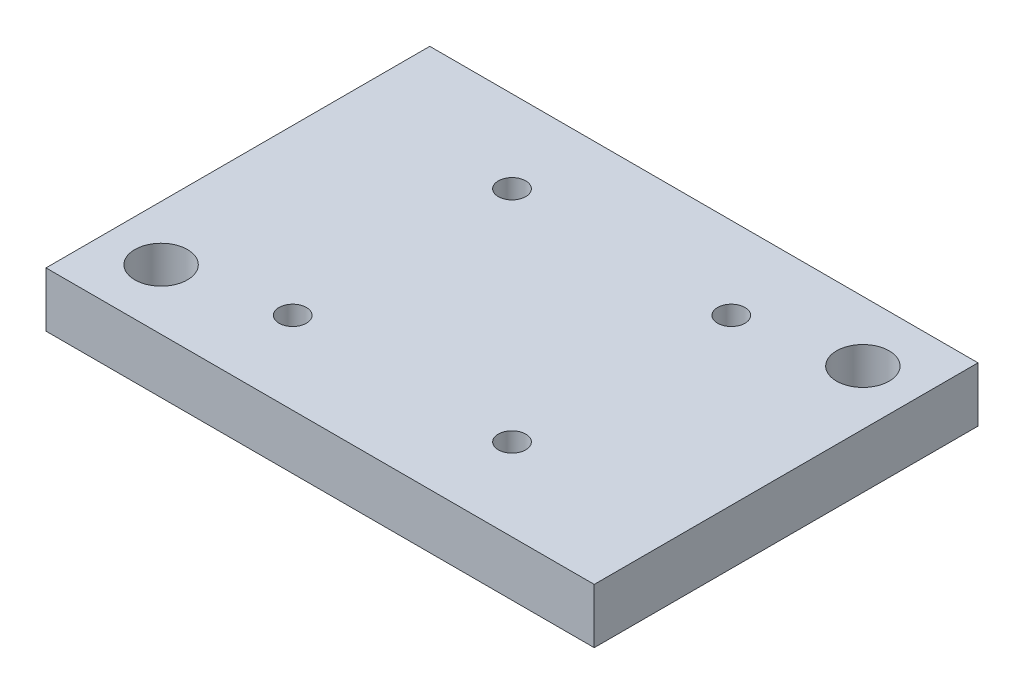
ISO-10303-21;
HEADER;
FILE_DESCRIPTION(('STEP AP214'),'2;1');
FILE_NAME('part.step','',(''),(''),'','','');
FILE_SCHEMA(('AUTOMOTIVE_DESIGN { 1 0 10303 214 1 1 1 1 }'));
ENDSEC;
DATA;
#1=APPLICATION_CONTEXT('core data for automotive mechanical design processes');
#2=APPLICATION_PROTOCOL_DEFINITION('international standard','automotive_design',2000,#1);
#3=PRODUCT_CONTEXT('',#1,'mechanical');
#4=PRODUCT('Part','Part','',(#3));
#5=PRODUCT_RELATED_PRODUCT_CATEGORY('part','',(#4));
#6=PRODUCT_DEFINITION_FORMATION('','',#4);
#7=PRODUCT_DEFINITION_CONTEXT('part definition',#1,'design');
#8=PRODUCT_DEFINITION('design','',#6,#7);
#9=PRODUCT_DEFINITION_SHAPE('','',#8);
#10=(LENGTH_UNIT() NAMED_UNIT(*) SI_UNIT(.MILLI.,.METRE.));
#11=(NAMED_UNIT(*) PLANE_ANGLE_UNIT() SI_UNIT($,.RADIAN.));
#12=(NAMED_UNIT(*) SI_UNIT($,.STERADIAN.) SOLID_ANGLE_UNIT());
#13=UNCERTAINTY_MEASURE_WITH_UNIT(LENGTH_MEASURE(1.E-05),#10,'distance_accuracy_value','');
#14=(GEOMETRIC_REPRESENTATION_CONTEXT(3) GLOBAL_UNCERTAINTY_ASSIGNED_CONTEXT((#13)) GLOBAL_UNIT_ASSIGNED_CONTEXT((#10,
#11,#12)) REPRESENTATION_CONTEXT('',''));
#15=CARTESIAN_POINT('',(0.,0.,0.));
#16=DIRECTION('',(0.,0.,1.));
#17=DIRECTION('',(1.,0.,0.));
#18=AXIS2_PLACEMENT_3D('',#15,#16,#17);
#19=CARTESIAN_POINT('',(-18.4285714285714,5.,-15.1428571428572));
#20=DIRECTION('',(1.,0.,0.));
#21=DIRECTION('',(0.,0.,-1.));
#22=AXIS2_PLACEMENT_3D('',#19,#20,#21);
#23=PLANE('',#22);
#24=DIRECTION('',(0.,0.,1.));
#25=VECTOR('',#24,1.);
#26=CARTESIAN_POINT('',(-18.4285714285714,0.,-15.1428571428572));
#27=LINE('',#26,#25);
#28=CARTESIAN_POINT('',(-18.4285714285714,0.,-15.1428571428572));
#29=VERTEX_POINT('',#28);
#30=CARTESIAN_POINT('',(-18.4285714285714,0.,19.8571428571429));
#31=VERTEX_POINT('',#30);
#32=EDGE_CURVE('E102',#29,#31,#27,.T.);
#33=ORIENTED_EDGE('',*,*,#32,.T.);
#34=DIRECTION('',(0.,-1.,0.));
#35=VECTOR('',#34,1.);
#36=CARTESIAN_POINT('',(-18.4285714285714,5.,19.8571428571429));
#37=LINE('',#36,#35);
#38=CARTESIAN_POINT('',(-18.4285714285714,5.,19.8571428571429));
#39=VERTEX_POINT('',#38);
#40=EDGE_CURVE('E11',#39,#31,#37,.T.);
#41=ORIENTED_EDGE('',*,*,#40,.F.);
#42=DIRECTION('',(0.,0.,1.));
#43=VECTOR('',#42,1.);
#44=CARTESIAN_POINT('',(-18.4285714285714,5.,-15.1428571428572));
#45=LINE('',#44,#43);
#46=CARTESIAN_POINT('',(-18.4285714285714,5.,-15.1428571428572));
#47=VERTEX_POINT('',#46);
#48=EDGE_CURVE('E90',#47,#39,#45,.T.);
#49=ORIENTED_EDGE('',*,*,#48,.F.);
#50=DIRECTION('',(0.,-1.,0.));
#51=VECTOR('',#50,1.);
#52=CARTESIAN_POINT('',(-18.4285714285714,5.,-15.1428571428572));
#53=LINE('',#52,#51);
#54=EDGE_CURVE('E98',#47,#29,#53,.T.);
#55=ORIENTED_EDGE('',*,*,#54,.T.);
#56=EDGE_LOOP('',(#33,#41,#49,#55));
#57=FACE_BOUND('',#56,.T.);
#58=ADVANCED_FACE('F39',(#57),#23,.F.);
#59=CARTESIAN_POINT('',(-18.4285714285714,5.,19.8571428571429));
#60=DIRECTION('',(0.,0.,-1.));
#61=DIRECTION('',(-1.,0.,0.));
#62=AXIS2_PLACEMENT_3D('',#59,#60,#61);
#63=PLANE('',#62);
#64=DIRECTION('',(1.,0.,0.));
#65=VECTOR('',#64,1.);
#66=CARTESIAN_POINT('',(-18.4285714285714,0.,19.8571428571429));
#67=LINE('',#66,#65);
#68=CARTESIAN_POINT('',(31.5714285714286,0.,19.8571428571429));
#69=VERTEX_POINT('',#68);
#70=EDGE_CURVE('E94',#31,#69,#67,.T.);
#71=ORIENTED_EDGE('',*,*,#70,.T.);
#72=DIRECTION('',(0.,-1.,0.));
#73=VECTOR('',#72,1.);
#74=CARTESIAN_POINT('',(31.5714285714286,5.,19.8571428571429));
#75=LINE('',#74,#73);
#76=CARTESIAN_POINT('',(31.5714285714286,5.,19.8571428571429));
#77=VERTEX_POINT('',#76);
#78=EDGE_CURVE('E47',#77,#69,#75,.T.);
#79=ORIENTED_EDGE('',*,*,#78,.F.);
#80=DIRECTION('',(1.,0.,0.));
#81=VECTOR('',#80,1.);
#82=CARTESIAN_POINT('',(-18.4285714285714,5.,19.8571428571429));
#83=LINE('',#82,#81);
#84=EDGE_CURVE('E85',#39,#77,#83,.T.);
#85=ORIENTED_EDGE('',*,*,#84,.F.);
#86=ORIENTED_EDGE('',*,*,#40,.T.);
#87=EDGE_LOOP('',(#71,#79,#85,#86));
#88=FACE_BOUND('',#87,.T.);
#89=ADVANCED_FACE('F93',(#88),#63,.F.);
#90=CARTESIAN_POINT('',(31.5714285714286,5.,-15.1428571428572));
#91=DIRECTION('',(-1.,0.,0.));
#92=DIRECTION('',(0.,0.,1.));
#93=AXIS2_PLACEMENT_3D('',#90,#91,#92);
#94=PLANE('',#93);
#95=DIRECTION('',(0.,0.,-1.));
#96=VECTOR('',#95,1.);
#97=CARTESIAN_POINT('',(31.5714285714286,0.,-15.1428571428572));
#98=LINE('',#97,#96);
#99=CARTESIAN_POINT('',(31.5714285714286,0.,-15.1428571428572));
#100=VERTEX_POINT('',#99);
#101=EDGE_CURVE('E72',#69,#100,#98,.T.);
#102=ORIENTED_EDGE('',*,*,#101,.T.);
#103=DIRECTION('',(0.,-1.,0.));
#104=VECTOR('',#103,1.);
#105=CARTESIAN_POINT('',(31.5714285714286,5.,-15.1428571428572));
#106=LINE('',#105,#104);
#107=CARTESIAN_POINT('',(31.5714285714286,5.,-15.1428571428572));
#108=VERTEX_POINT('',#107);
#109=EDGE_CURVE('E95',#108,#100,#106,.T.);
#110=ORIENTED_EDGE('',*,*,#109,.F.);
#111=DIRECTION('',(0.,0.,-1.));
#112=VECTOR('',#111,1.);
#113=CARTESIAN_POINT('',(31.5714285714286,5.,-15.1428571428572));
#114=LINE('',#113,#112);
#115=EDGE_CURVE('E88',#77,#108,#114,.T.);
#116=ORIENTED_EDGE('',*,*,#115,.F.);
#117=ORIENTED_EDGE('',*,*,#78,.T.);
#118=EDGE_LOOP('',(#102,#110,#116,#117));
#119=FACE_BOUND('',#118,.T.);
#120=ADVANCED_FACE('F96',(#119),#94,.F.);
#121=CARTESIAN_POINT('',(-18.4285714285714,5.,-15.1428571428572));
#122=DIRECTION('',(0.,0.,1.));
#123=DIRECTION('',(1.,0.,0.));
#124=AXIS2_PLACEMENT_3D('',#121,#122,#123);
#125=PLANE('',#124);
#126=DIRECTION('',(-1.,0.,0.));
#127=VECTOR('',#126,1.);
#128=CARTESIAN_POINT('',(-18.4285714285714,0.,-15.1428571428572));
#129=LINE('',#128,#127);
#130=EDGE_CURVE('E78',#100,#29,#129,.T.);
#131=ORIENTED_EDGE('',*,*,#130,.T.);
#132=ORIENTED_EDGE('',*,*,#54,.F.);
#133=DIRECTION('',(-1.,0.,0.));
#134=VECTOR('',#133,1.);
#135=CARTESIAN_POINT('',(-18.4285714285714,5.,-15.1428571428572));
#136=LINE('',#135,#134);
#137=EDGE_CURVE('E55',#108,#47,#136,.T.);
#138=ORIENTED_EDGE('',*,*,#137,.F.);
#139=ORIENTED_EDGE('',*,*,#109,.T.);
#140=EDGE_LOOP('',(#131,#132,#138,#139));
#141=FACE_BOUND('',#140,.T.);
#142=ADVANCED_FACE('F110',(#141),#125,.F.);
#143=CARTESIAN_POINT('',(0.,5.,0.));
#144=DIRECTION('',(0.,1.,0.));
#145=DIRECTION('',(0.,0.,1.));
#146=AXIS2_PLACEMENT_3D('',#143,#144,#145);
#147=PLANE('',#146);
#148=CARTESIAN_POINT('',(-13.4285714285714,5.,14.3571428571429));
#149=DIRECTION('',(0.,1.,0.));
#150=DIRECTION('',(0.,0.,1.));
#151=AXIS2_PLACEMENT_3D('',#148,#149,#150);
#152=CIRCLE('',#151,2.4);
#153=CARTESIAN_POINT('',(-13.4285714285714,5.,16.7571428571429));
#154=VERTEX_POINT('',#153);
#155=EDGE_CURVE('E148',#154,#154,#152,.T.);
#156=ORIENTED_EDGE('',*,*,#155,.F.);
#157=EDGE_LOOP('',(#156));
#158=FACE_BOUND('',#157,.T.);
#159=CARTESIAN_POINT('',(26.5714285714286,5.,-9.64285714285715));
#160=DIRECTION('',(0.,1.,0.));
#161=DIRECTION('',(0.,0.,1.));
#162=AXIS2_PLACEMENT_3D('',#159,#160,#161);
#163=CIRCLE('',#162,2.4);
#164=CARTESIAN_POINT('',(26.5714285714286,5.,-7.24285714285715));
#165=VERTEX_POINT('',#164);
#166=EDGE_CURVE('E142',#165,#165,#163,.T.);
#167=ORIENTED_EDGE('',*,*,#166,.F.);
#168=EDGE_LOOP('',(#167));
#169=FACE_BOUND('',#168,.T.);
#170=CARTESIAN_POINT('',(-3.42857142857143,5.,-7.64285714285715));
#171=DIRECTION('',(0.,1.,0.));
#172=DIRECTION('',(0.,0.,1.));
#173=AXIS2_PLACEMENT_3D('',#170,#171,#172);
#174=CIRCLE('',#173,1.25);
#175=CARTESIAN_POINT('',(-3.42857142857143,5.,-6.39285714285715));
#176=VERTEX_POINT('',#175);
#177=EDGE_CURVE('E136',#176,#176,#174,.T.);
#178=ORIENTED_EDGE('',*,*,#177,.F.);
#179=EDGE_LOOP('',(#178));
#180=FACE_BOUND('',#179,.T.);
#181=CARTESIAN_POINT('',(-3.42857142857143,5.,12.3571428571429));
#182=DIRECTION('',(0.,1.,0.));
#183=DIRECTION('',(0.,0.,1.));
#184=AXIS2_PLACEMENT_3D('',#181,#182,#183);
#185=CIRCLE('',#184,1.25);
#186=CARTESIAN_POINT('',(-3.42857142857143,5.,13.6071428571429));
#187=VERTEX_POINT('',#186);
#188=EDGE_CURVE('E130',#187,#187,#185,.T.);
#189=ORIENTED_EDGE('',*,*,#188,.F.);
#190=EDGE_LOOP('',(#189));
#191=FACE_BOUND('',#190,.T.);
#192=CARTESIAN_POINT('',(16.5714285714286,5.,12.3571428571428));
#193=DIRECTION('',(0.,1.,0.));
#194=DIRECTION('',(0.,0.,1.));
#195=AXIS2_PLACEMENT_3D('',#192,#193,#194);
#196=CIRCLE('',#195,1.25);
#197=CARTESIAN_POINT('',(16.5714285714286,5.,13.6071428571428));
#198=VERTEX_POINT('',#197);
#199=EDGE_CURVE('E124',#198,#198,#196,.T.);
#200=ORIENTED_EDGE('',*,*,#199,.F.);
#201=EDGE_LOOP('',(#200));
#202=FACE_BOUND('',#201,.T.);
#203=CARTESIAN_POINT('',(16.5714285714286,5.,-7.64285714285715));
#204=DIRECTION('',(0.,1.,0.));
#205=DIRECTION('',(0.,0.,1.));
#206=AXIS2_PLACEMENT_3D('',#203,#204,#205);
#207=CIRCLE('',#206,1.25);
#208=CARTESIAN_POINT('',(16.5714285714286,5.,-6.39285714285715));
#209=VERTEX_POINT('',#208);
#210=EDGE_CURVE('E118',#209,#209,#207,.T.);
#211=ORIENTED_EDGE('',*,*,#210,.F.);
#212=EDGE_LOOP('',(#211));
#213=FACE_BOUND('',#212,.T.);
#214=ORIENTED_EDGE('',*,*,#48,.T.);
#215=ORIENTED_EDGE('',*,*,#84,.T.);
#216=ORIENTED_EDGE('',*,*,#115,.T.);
#217=ORIENTED_EDGE('',*,*,#137,.T.);
#218=EDGE_LOOP('',(#214,#215,#216,#217));
#219=FACE_BOUND('',#218,.T.);
#220=ADVANCED_FACE('F86',(#158,#169,#180,#191,#202,#213,#219),#147,.T.);
#221=CARTESIAN_POINT('',(0.,0.,0.));
#222=DIRECTION('',(0.,1.,0.));
#223=DIRECTION('',(0.,0.,1.));
#224=AXIS2_PLACEMENT_3D('',#221,#222,#223);
#225=PLANE('',#224);
#226=CARTESIAN_POINT('',(-13.4285714285714,0.,14.3571428571429));
#227=DIRECTION('',(0.,1.,0.));
#228=DIRECTION('',(0.,0.,1.));
#229=AXIS2_PLACEMENT_3D('',#226,#227,#228);
#230=CIRCLE('',#229,2.4);
#231=CARTESIAN_POINT('',(-13.4285714285714,0.,16.7571428571428));
#232=VERTEX_POINT('',#231);
#233=EDGE_CURVE('E145',#232,#232,#230,.T.);
#234=ORIENTED_EDGE('',*,*,#233,.T.);
#235=EDGE_LOOP('',(#234));
#236=FACE_BOUND('',#235,.T.);
#237=CARTESIAN_POINT('',(26.5714285714286,0.,-9.64285714285715));
#238=DIRECTION('',(0.,1.,0.));
#239=DIRECTION('',(0.,0.,1.));
#240=AXIS2_PLACEMENT_3D('',#237,#238,#239);
#241=CIRCLE('',#240,2.4);
#242=CARTESIAN_POINT('',(26.5714285714286,0.,-7.24285714285715));
#243=VERTEX_POINT('',#242);
#244=EDGE_CURVE('E139',#243,#243,#241,.T.);
#245=ORIENTED_EDGE('',*,*,#244,.T.);
#246=EDGE_LOOP('',(#245));
#247=FACE_BOUND('',#246,.T.);
#248=CARTESIAN_POINT('',(-3.42857142857143,0.,-7.64285714285715));
#249=DIRECTION('',(0.,1.,0.));
#250=DIRECTION('',(0.,0.,1.));
#251=AXIS2_PLACEMENT_3D('',#248,#249,#250);
#252=CIRCLE('',#251,1.25);
#253=CARTESIAN_POINT('',(-3.42857142857143,0.,-6.39285714285715));
#254=VERTEX_POINT('',#253);
#255=EDGE_CURVE('E133',#254,#254,#252,.T.);
#256=ORIENTED_EDGE('',*,*,#255,.T.);
#257=EDGE_LOOP('',(#256));
#258=FACE_BOUND('',#257,.T.);
#259=CARTESIAN_POINT('',(-3.42857142857143,0.,12.3571428571429));
#260=DIRECTION('',(0.,1.,0.));
#261=DIRECTION('',(0.,0.,1.));
#262=AXIS2_PLACEMENT_3D('',#259,#260,#261);
#263=CIRCLE('',#262,1.25);
#264=CARTESIAN_POINT('',(-3.42857142857143,0.,13.6071428571428));
#265=VERTEX_POINT('',#264);
#266=EDGE_CURVE('E127',#265,#265,#263,.T.);
#267=ORIENTED_EDGE('',*,*,#266,.T.);
#268=EDGE_LOOP('',(#267));
#269=FACE_BOUND('',#268,.T.);
#270=CARTESIAN_POINT('',(16.5714285714286,0.,12.3571428571428));
#271=DIRECTION('',(0.,1.,0.));
#272=DIRECTION('',(0.,0.,1.));
#273=AXIS2_PLACEMENT_3D('',#270,#271,#272);
#274=CIRCLE('',#273,1.25);
#275=CARTESIAN_POINT('',(16.5714285714286,0.,13.6071428571428));
#276=VERTEX_POINT('',#275);
#277=EDGE_CURVE('E121',#276,#276,#274,.T.);
#278=ORIENTED_EDGE('',*,*,#277,.T.);
#279=EDGE_LOOP('',(#278));
#280=FACE_BOUND('',#279,.T.);
#281=CARTESIAN_POINT('',(16.5714285714286,0.,-7.64285714285715));
#282=DIRECTION('',(0.,1.,0.));
#283=DIRECTION('',(0.,0.,1.));
#284=AXIS2_PLACEMENT_3D('',#281,#282,#283);
#285=CIRCLE('',#284,1.25);
#286=CARTESIAN_POINT('',(16.5714285714286,0.,-6.39285714285715));
#287=VERTEX_POINT('',#286);
#288=EDGE_CURVE('E105',#287,#287,#285,.T.);
#289=ORIENTED_EDGE('',*,*,#288,.T.);
#290=EDGE_LOOP('',(#289));
#291=FACE_BOUND('',#290,.T.);
#292=ORIENTED_EDGE('',*,*,#32,.F.);
#293=ORIENTED_EDGE('',*,*,#130,.F.);
#294=ORIENTED_EDGE('',*,*,#101,.F.);
#295=ORIENTED_EDGE('',*,*,#70,.F.);
#296=EDGE_LOOP('',(#292,#293,#294,#295));
#297=FACE_BOUND('',#296,.T.);
#298=ADVANCED_FACE('F113',(#236,#247,#258,#269,#280,#291,#297),#225,.F.);
#299=CARTESIAN_POINT('',(16.5714285714286,5.,-7.64285714285715));
#300=DIRECTION('',(0.,1.,0.));
#301=DIRECTION('',(0.,0.,1.));
#302=AXIS2_PLACEMENT_3D('',#299,#300,#301);
#303=CYLINDRICAL_SURFACE('',#302,1.25);
#304=ORIENTED_EDGE('',*,*,#288,.F.);
#305=EDGE_LOOP('',(#304));
#306=FACE_BOUND('',#305,.T.);
#307=ORIENTED_EDGE('',*,*,#210,.T.);
#308=EDGE_LOOP('',(#307));
#309=FACE_BOUND('',#308,.T.);
#310=ADVANCED_FACE('F167',(#306,#309),#303,.F.);
#311=CARTESIAN_POINT('',(16.5714285714286,5.,12.3571428571428));
#312=DIRECTION('',(0.,1.,0.));
#313=DIRECTION('',(0.,0.,1.));
#314=AXIS2_PLACEMENT_3D('',#311,#312,#313);
#315=CYLINDRICAL_SURFACE('',#314,1.25);
#316=ORIENTED_EDGE('',*,*,#277,.F.);
#317=EDGE_LOOP('',(#316));
#318=FACE_BOUND('',#317,.T.);
#319=ORIENTED_EDGE('',*,*,#199,.T.);
#320=EDGE_LOOP('',(#319));
#321=FACE_BOUND('',#320,.T.);
#322=ADVANCED_FACE('F169',(#318,#321),#315,.F.);
#323=CARTESIAN_POINT('',(-3.42857142857143,5.,12.3571428571429));
#324=DIRECTION('',(0.,1.,0.));
#325=DIRECTION('',(0.,0.,1.));
#326=AXIS2_PLACEMENT_3D('',#323,#324,#325);
#327=CYLINDRICAL_SURFACE('',#326,1.25);
#328=ORIENTED_EDGE('',*,*,#266,.F.);
#329=EDGE_LOOP('',(#328));
#330=FACE_BOUND('',#329,.T.);
#331=ORIENTED_EDGE('',*,*,#188,.T.);
#332=EDGE_LOOP('',(#331));
#333=FACE_BOUND('',#332,.T.);
#334=ADVANCED_FACE('F176',(#330,#333),#327,.F.);
#335=CARTESIAN_POINT('',(-3.42857142857143,5.,-7.64285714285715));
#336=DIRECTION('',(0.,1.,0.));
#337=DIRECTION('',(0.,0.,1.));
#338=AXIS2_PLACEMENT_3D('',#335,#336,#337);
#339=CYLINDRICAL_SURFACE('',#338,1.25);
#340=ORIENTED_EDGE('',*,*,#255,.F.);
#341=EDGE_LOOP('',(#340));
#342=FACE_BOUND('',#341,.T.);
#343=ORIENTED_EDGE('',*,*,#177,.T.);
#344=EDGE_LOOP('',(#343));
#345=FACE_BOUND('',#344,.T.);
#346=ADVANCED_FACE('F224',(#342,#345),#339,.F.);
#347=CARTESIAN_POINT('',(26.5714285714286,5.,-9.64285714285715));
#348=DIRECTION('',(0.,1.,0.));
#349=DIRECTION('',(0.,0.,1.));
#350=AXIS2_PLACEMENT_3D('',#347,#348,#349);
#351=CYLINDRICAL_SURFACE('',#350,2.4);
#352=ORIENTED_EDGE('',*,*,#244,.F.);
#353=EDGE_LOOP('',(#352));
#354=FACE_BOUND('',#353,.T.);
#355=ORIENTED_EDGE('',*,*,#166,.T.);
#356=EDGE_LOOP('',(#355));
#357=FACE_BOUND('',#356,.T.);
#358=ADVANCED_FACE('F234',(#354,#357),#351,.F.);
#359=CARTESIAN_POINT('',(-13.4285714285714,5.,14.3571428571429));
#360=DIRECTION('',(0.,1.,0.));
#361=DIRECTION('',(0.,0.,1.));
#362=AXIS2_PLACEMENT_3D('',#359,#360,#361);
#363=CYLINDRICAL_SURFACE('',#362,2.4);
#364=ORIENTED_EDGE('',*,*,#233,.F.);
#365=EDGE_LOOP('',(#364));
#366=FACE_BOUND('',#365,.T.);
#367=ORIENTED_EDGE('',*,*,#155,.T.);
#368=EDGE_LOOP('',(#367));
#369=FACE_BOUND('',#368,.T.);
#370=ADVANCED_FACE('F152',(#366,#369),#363,.F.);
#371=CLOSED_SHELL('',(#58,#89,#120,#142,#220,#298,#310,#322,#334,#346,#358,#370));
#372=MANIFOLD_SOLID_BREP('B2',#371);
#373=ADVANCED_BREP_SHAPE_REPRESENTATION('',(#18,#372),#14);
#374=SHAPE_DEFINITION_REPRESENTATION(#9,#373);
ENDSEC;
END-ISO-10303-21;
